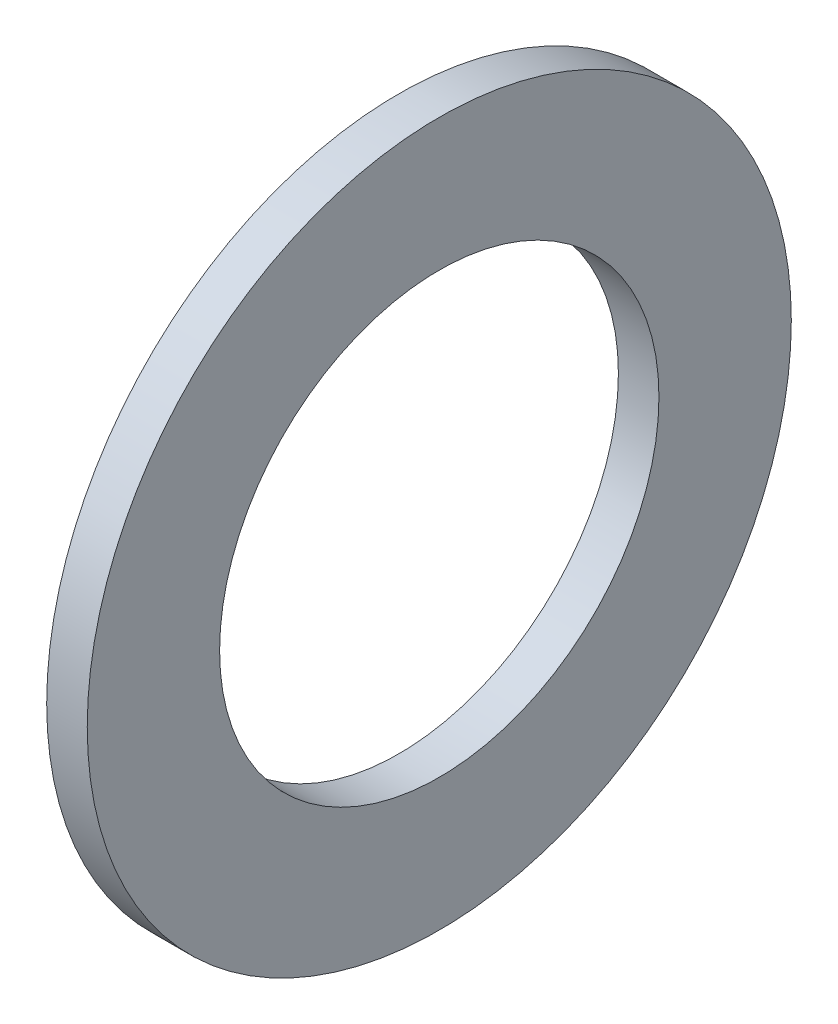
ISO-10303-21;
HEADER;
FILE_DESCRIPTION(('STEP AP214'),'2;1');
FILE_NAME('part.step','',(''),(''),'','','');
FILE_SCHEMA(('AUTOMOTIVE_DESIGN { 1 0 10303 214 1 1 1 1 }'));
ENDSEC;
DATA;
#1=APPLICATION_CONTEXT('core data for automotive mechanical design processes');
#2=APPLICATION_PROTOCOL_DEFINITION('international standard','automotive_design',2000,#1);
#3=PRODUCT_CONTEXT('',#1,'mechanical');
#4=PRODUCT('Part','Part','',(#3));
#5=PRODUCT_RELATED_PRODUCT_CATEGORY('part','',(#4));
#6=PRODUCT_DEFINITION_FORMATION('','',#4);
#7=PRODUCT_DEFINITION_CONTEXT('part definition',#1,'design');
#8=PRODUCT_DEFINITION('design','',#6,#7);
#9=PRODUCT_DEFINITION_SHAPE('','',#8);
#10=(LENGTH_UNIT() NAMED_UNIT(*) SI_UNIT(.MILLI.,.METRE.));
#11=(NAMED_UNIT(*) PLANE_ANGLE_UNIT() SI_UNIT($,.RADIAN.));
#12=(NAMED_UNIT(*) SI_UNIT($,.STERADIAN.) SOLID_ANGLE_UNIT());
#13=UNCERTAINTY_MEASURE_WITH_UNIT(LENGTH_MEASURE(1.E-05),#10,'distance_accuracy_value','');
#14=(GEOMETRIC_REPRESENTATION_CONTEXT(3) GLOBAL_UNCERTAINTY_ASSIGNED_CONTEXT((#13)) GLOBAL_UNIT_ASSIGNED_CONTEXT((#10,
#11,#12)) REPRESENTATION_CONTEXT('',''));
#15=CARTESIAN_POINT('',(0.,0.,0.));
#16=DIRECTION('',(0.,0.,1.));
#17=DIRECTION('',(1.,0.,0.));
#18=AXIS2_PLACEMENT_3D('',#15,#16,#17);
#19=CARTESIAN_POINT('',(0.9144,0.,0.));
#20=DIRECTION('',(1.,0.,0.));
#21=DIRECTION('',(0.,0.,-1.));
#22=AXIS2_PLACEMENT_3D('',#19,#20,#21);
#23=PLANE('',#22);
#24=CARTESIAN_POINT('',(0.9144,0.,0.));
#25=DIRECTION('',(1.,0.,0.));
#26=DIRECTION('',(0.,0.,-1.));
#27=AXIS2_PLACEMENT_3D('',#24,#25,#26);
#28=CIRCLE('',#27,7.9375);
#29=CARTESIAN_POINT('',(0.9144,0.,-7.9375));
#30=VERTEX_POINT('',#29);
#31=EDGE_CURVE('E10',#30,#30,#28,.T.);
#32=ORIENTED_EDGE('',*,*,#31,.T.);
#33=EDGE_LOOP('',(#32));
#34=FACE_BOUND('',#33,.T.);
#35=CARTESIAN_POINT('',(0.9144,0.,0.));
#36=DIRECTION('',(1.,0.,0.));
#37=DIRECTION('',(0.,0.,-1.));
#38=AXIS2_PLACEMENT_3D('',#35,#36,#37);
#39=CIRCLE('',#38,4.953);
#40=CARTESIAN_POINT('',(0.9144,0.,-4.953));
#41=VERTEX_POINT('',#40);
#42=EDGE_CURVE('E41',#41,#41,#39,.T.);
#43=ORIENTED_EDGE('',*,*,#42,.F.);
#44=EDGE_LOOP('',(#43));
#45=FACE_BOUND('',#44,.T.);
#46=ADVANCED_FACE('F30',(#34,#45),#23,.T.);
#47=CARTESIAN_POINT('',(0.,0.,0.));
#48=DIRECTION('',(1.,0.,0.));
#49=DIRECTION('',(0.,0.,-1.));
#50=AXIS2_PLACEMENT_3D('',#47,#48,#49);
#51=PLANE('',#50);
#52=CARTESIAN_POINT('',(0.,0.,0.));
#53=DIRECTION('',(1.,0.,0.));
#54=DIRECTION('',(0.,0.,-1.));
#55=AXIS2_PLACEMENT_3D('',#52,#53,#54);
#56=CIRCLE('',#55,7.9375);
#57=CARTESIAN_POINT('',(0.,0.,-7.9375));
#58=VERTEX_POINT('',#57);
#59=EDGE_CURVE('E34',#58,#58,#56,.T.);
#60=ORIENTED_EDGE('',*,*,#59,.F.);
#61=EDGE_LOOP('',(#60));
#62=FACE_BOUND('',#61,.T.);
#63=CARTESIAN_POINT('',(0.,0.,0.));
#64=DIRECTION('',(1.,0.,0.));
#65=DIRECTION('',(0.,0.,-1.));
#66=AXIS2_PLACEMENT_3D('',#63,#64,#65);
#67=CIRCLE('',#66,4.953);
#68=CARTESIAN_POINT('',(0.,0.,-4.953));
#69=VERTEX_POINT('',#68);
#70=EDGE_CURVE('E43',#69,#69,#67,.T.);
#71=ORIENTED_EDGE('',*,*,#70,.T.);
#72=EDGE_LOOP('',(#71));
#73=FACE_BOUND('',#72,.T.);
#74=ADVANCED_FACE('F53',(#62,#73),#51,.F.);
#75=CARTESIAN_POINT('',(0.9144,0.,0.));
#76=DIRECTION('',(-1.,0.,0.));
#77=DIRECTION('',(0.,0.,1.));
#78=AXIS2_PLACEMENT_3D('',#75,#76,#77);
#79=CYLINDRICAL_SURFACE('',#78,7.9375);
#80=ORIENTED_EDGE('',*,*,#31,.F.);
#81=EDGE_LOOP('',(#80));
#82=FACE_BOUND('',#81,.T.);
#83=ORIENTED_EDGE('',*,*,#59,.T.);
#84=EDGE_LOOP('',(#83));
#85=FACE_BOUND('',#84,.T.);
#86=ADVANCED_FACE('F32',(#82,#85),#79,.T.);
#87=CARTESIAN_POINT('',(0.9144,0.,0.));
#88=DIRECTION('',(-1.,0.,0.));
#89=DIRECTION('',(0.,0.,1.));
#90=AXIS2_PLACEMENT_3D('',#87,#88,#89);
#91=CYLINDRICAL_SURFACE('',#90,4.953);
#92=ORIENTED_EDGE('',*,*,#42,.T.);
#93=EDGE_LOOP('',(#92));
#94=FACE_BOUND('',#93,.T.);
#95=ORIENTED_EDGE('',*,*,#70,.F.);
#96=EDGE_LOOP('',(#95));
#97=FACE_BOUND('',#96,.T.);
#98=ADVANCED_FACE('F49',(#94,#97),#91,.F.);
#99=CLOSED_SHELL('',(#46,#74,#86,#98));
#100=MANIFOLD_SOLID_BREP('B2',#99);
#101=ADVANCED_BREP_SHAPE_REPRESENTATION('',(#18,#100),#14);
#102=SHAPE_DEFINITION_REPRESENTATION(#9,#101);
ENDSEC;
END-ISO-10303-21;
